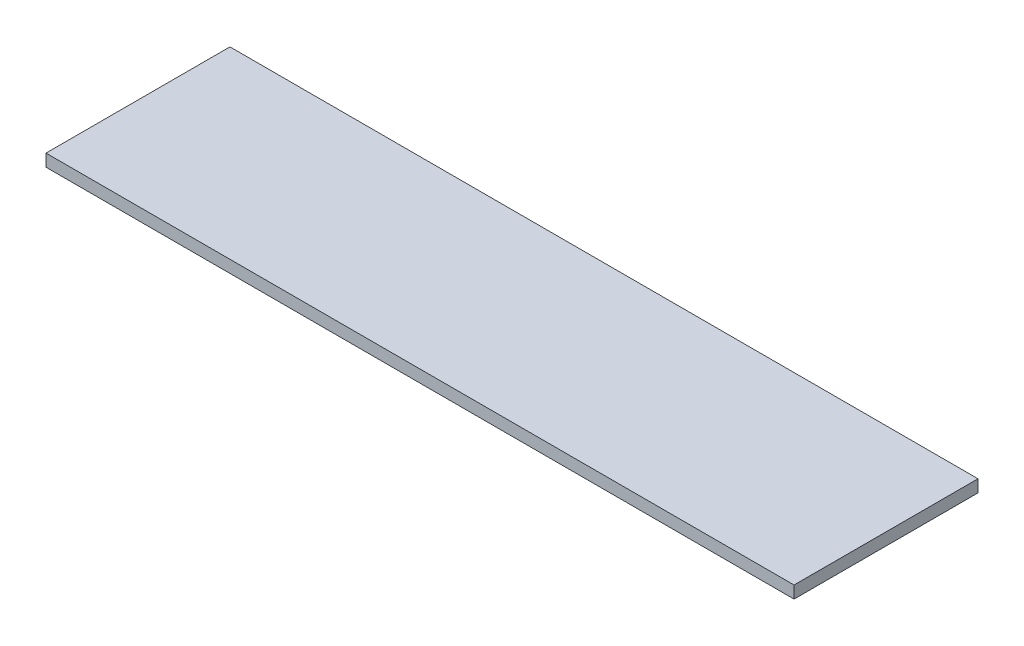
ISO-10303-21;
HEADER;
FILE_DESCRIPTION(('STEP AP214'),'2;1');
FILE_NAME('part.step','',(''),(''),'','','');
FILE_SCHEMA(('AUTOMOTIVE_DESIGN { 1 0 10303 214 1 1 1 1 }'));
ENDSEC;
DATA;
#1=APPLICATION_CONTEXT('core data for automotive mechanical design processes');
#2=APPLICATION_PROTOCOL_DEFINITION('international standard','automotive_design',2000,#1);
#3=PRODUCT_CONTEXT('',#1,'mechanical');
#4=PRODUCT('Part','Part','',(#3));
#5=PRODUCT_RELATED_PRODUCT_CATEGORY('part','',(#4));
#6=PRODUCT_DEFINITION_FORMATION('','',#4);
#7=PRODUCT_DEFINITION_CONTEXT('part definition',#1,'design');
#8=PRODUCT_DEFINITION('design','',#6,#7);
#9=PRODUCT_DEFINITION_SHAPE('','',#8);
#10=(LENGTH_UNIT() NAMED_UNIT(*) SI_UNIT(.MILLI.,.METRE.));
#11=(NAMED_UNIT(*) PLANE_ANGLE_UNIT() SI_UNIT($,.RADIAN.));
#12=(NAMED_UNIT(*) SI_UNIT($,.STERADIAN.) SOLID_ANGLE_UNIT());
#13=UNCERTAINTY_MEASURE_WITH_UNIT(LENGTH_MEASURE(1.E-05),#10,'distance_accuracy_value','');
#14=(GEOMETRIC_REPRESENTATION_CONTEXT(3) GLOBAL_UNCERTAINTY_ASSIGNED_CONTEXT((#13)) GLOBAL_UNIT_ASSIGNED_CONTEXT((#10,
#11,#12)) REPRESENTATION_CONTEXT('',''));
#15=CARTESIAN_POINT('',(0.,0.,0.));
#16=DIRECTION('',(0.,0.,1.));
#17=DIRECTION('',(1.,0.,0.));
#18=AXIS2_PLACEMENT_3D('',#15,#16,#17);
#19=CARTESIAN_POINT('',(0.,12.7,0.));
#20=DIRECTION('',(1.,0.,0.));
#21=DIRECTION('',(0.,0.,-1.));
#22=AXIS2_PLACEMENT_3D('',#19,#20,#21);
#23=PLANE('',#22);
#24=DIRECTION('',(0.,0.,1.));
#25=VECTOR('',#24,1.);
#26=CARTESIAN_POINT('',(0.,0.,0.));
#27=LINE('',#26,#25);
#28=CARTESIAN_POINT('',(0.,0.,-190.5));
#29=VERTEX_POINT('',#28);
#30=CARTESIAN_POINT('',(0.,0.,0.));
#31=VERTEX_POINT('',#30);
#32=EDGE_CURVE('E113',#29,#31,#27,.T.);
#33=ORIENTED_EDGE('',*,*,#32,.T.);
#34=DIRECTION('',(0.,-1.,0.));
#35=VECTOR('',#34,1.);
#36=CARTESIAN_POINT('',(0.,12.7,0.));
#37=LINE('',#36,#35);
#38=CARTESIAN_POINT('',(0.,12.7,0.));
#39=VERTEX_POINT('',#38);
#40=EDGE_CURVE('E11',#39,#31,#37,.T.);
#41=ORIENTED_EDGE('',*,*,#40,.F.);
#42=DIRECTION('',(0.,0.,1.));
#43=VECTOR('',#42,1.);
#44=CARTESIAN_POINT('',(0.,12.7,0.));
#45=LINE('',#44,#43);
#46=CARTESIAN_POINT('',(0.,12.7,-190.5));
#47=VERTEX_POINT('',#46);
#48=EDGE_CURVE('E97',#47,#39,#45,.T.);
#49=ORIENTED_EDGE('',*,*,#48,.F.);
#50=DIRECTION('',(0.,-1.,0.));
#51=VECTOR('',#50,1.);
#52=CARTESIAN_POINT('',(0.,12.7,-190.5));
#53=LINE('',#52,#51);
#54=EDGE_CURVE('E109',#47,#29,#53,.T.);
#55=ORIENTED_EDGE('',*,*,#54,.T.);
#56=EDGE_LOOP('',(#33,#41,#49,#55));
#57=FACE_BOUND('',#56,.T.);
#58=ADVANCED_FACE('F45',(#57),#23,.F.);
#59=CARTESIAN_POINT('',(0.,12.7,0.));
#60=DIRECTION('',(0.,0.,-1.));
#61=DIRECTION('',(-1.,0.,0.));
#62=AXIS2_PLACEMENT_3D('',#59,#60,#61);
#63=PLANE('',#62);
#64=DIRECTION('',(1.,0.,0.));
#65=VECTOR('',#64,1.);
#66=CARTESIAN_POINT('',(0.,0.,0.));
#67=LINE('',#66,#65);
#68=CARTESIAN_POINT('',(774.7,0.,0.));
#69=VERTEX_POINT('',#68);
#70=EDGE_CURVE('E102',#31,#69,#67,.T.);
#71=ORIENTED_EDGE('',*,*,#70,.T.);
#72=DIRECTION('',(0.,-1.,0.));
#73=VECTOR('',#72,1.);
#74=CARTESIAN_POINT('',(774.7,12.7,0.));
#75=LINE('',#74,#73);
#76=CARTESIAN_POINT('',(774.7,12.7,0.));
#77=VERTEX_POINT('',#76);
#78=EDGE_CURVE('E54',#77,#69,#75,.T.);
#79=ORIENTED_EDGE('',*,*,#78,.F.);
#80=DIRECTION('',(1.,0.,0.));
#81=VECTOR('',#80,1.);
#82=CARTESIAN_POINT('',(0.,12.7,0.));
#83=LINE('',#82,#81);
#84=EDGE_CURVE('E92',#39,#77,#83,.T.);
#85=ORIENTED_EDGE('',*,*,#84,.F.);
#86=ORIENTED_EDGE('',*,*,#40,.T.);
#87=EDGE_LOOP('',(#71,#79,#85,#86));
#88=FACE_BOUND('',#87,.T.);
#89=ADVANCED_FACE('F101',(#88),#63,.F.);
#90=CARTESIAN_POINT('',(774.7,12.7,0.));
#91=DIRECTION('',(-1.,0.,0.));
#92=DIRECTION('',(0.,0.,1.));
#93=AXIS2_PLACEMENT_3D('',#90,#91,#92);
#94=PLANE('',#93);
#95=DIRECTION('',(0.,0.,-1.));
#96=VECTOR('',#95,1.);
#97=CARTESIAN_POINT('',(774.7,0.,0.));
#98=LINE('',#97,#96);
#99=CARTESIAN_POINT('',(774.7,0.,-190.5));
#100=VERTEX_POINT('',#99);
#101=EDGE_CURVE('E79',#69,#100,#98,.T.);
#102=ORIENTED_EDGE('',*,*,#101,.T.);
#103=DIRECTION('',(0.,-1.,0.));
#104=VECTOR('',#103,1.);
#105=CARTESIAN_POINT('',(774.7,12.7,-190.5));
#106=LINE('',#105,#104);
#107=CARTESIAN_POINT('',(774.7,12.7,-190.5));
#108=VERTEX_POINT('',#107);
#109=EDGE_CURVE('E104',#108,#100,#106,.T.);
#110=ORIENTED_EDGE('',*,*,#109,.F.);
#111=DIRECTION('',(0.,0.,-1.));
#112=VECTOR('',#111,1.);
#113=CARTESIAN_POINT('',(774.7,12.7,0.));
#114=LINE('',#113,#112);
#115=EDGE_CURVE('E95',#77,#108,#114,.T.);
#116=ORIENTED_EDGE('',*,*,#115,.F.);
#117=ORIENTED_EDGE('',*,*,#78,.T.);
#118=EDGE_LOOP('',(#102,#110,#116,#117));
#119=FACE_BOUND('',#118,.T.);
#120=ADVANCED_FACE('F105',(#119),#94,.F.);
#121=CARTESIAN_POINT('',(0.,12.7,-190.5));
#122=DIRECTION('',(0.,0.,1.));
#123=DIRECTION('',(1.,0.,0.));
#124=AXIS2_PLACEMENT_3D('',#121,#122,#123);
#125=PLANE('',#124);
#126=DIRECTION('',(-1.,0.,0.));
#127=VECTOR('',#126,1.);
#128=CARTESIAN_POINT('',(0.,0.,-190.5));
#129=LINE('',#128,#127);
#130=EDGE_CURVE('E85',#100,#29,#129,.T.);
#131=ORIENTED_EDGE('',*,*,#130,.T.);
#132=ORIENTED_EDGE('',*,*,#54,.F.);
#133=DIRECTION('',(-1.,0.,0.));
#134=VECTOR('',#133,1.);
#135=CARTESIAN_POINT('',(0.,12.7,-190.5));
#136=LINE('',#135,#134);
#137=EDGE_CURVE('E62',#108,#47,#136,.T.);
#138=ORIENTED_EDGE('',*,*,#137,.F.);
#139=ORIENTED_EDGE('',*,*,#109,.T.);
#140=EDGE_LOOP('',(#131,#132,#138,#139));
#141=FACE_BOUND('',#140,.T.);
#142=ADVANCED_FACE('F126',(#141),#125,.F.);
#143=CARTESIAN_POINT('',(0.,12.7,0.));
#144=DIRECTION('',(0.,-1.,0.));
#145=DIRECTION('',(0.,0.,-1.));
#146=AXIS2_PLACEMENT_3D('',#143,#144,#145);
#147=PLANE('',#146);
#148=ORIENTED_EDGE('',*,*,#48,.T.);
#149=ORIENTED_EDGE('',*,*,#84,.T.);
#150=ORIENTED_EDGE('',*,*,#115,.T.);
#151=ORIENTED_EDGE('',*,*,#137,.T.);
#152=EDGE_LOOP('',(#148,#149,#150,#151));
#153=FACE_BOUND('',#152,.T.);
#154=ADVANCED_FACE('F93',(#153),#147,.F.);
#155=CARTESIAN_POINT('',(0.,0.,0.));
#156=DIRECTION('',(0.,-1.,0.));
#157=DIRECTION('',(0.,0.,-1.));
#158=AXIS2_PLACEMENT_3D('',#155,#156,#157);
#159=PLANE('',#158);
#160=ORIENTED_EDGE('',*,*,#32,.F.);
#161=ORIENTED_EDGE('',*,*,#130,.F.);
#162=ORIENTED_EDGE('',*,*,#101,.F.);
#163=ORIENTED_EDGE('',*,*,#70,.F.);
#164=EDGE_LOOP('',(#160,#161,#162,#163));
#165=FACE_BOUND('',#164,.T.);
#166=ADVANCED_FACE('F129',(#165),#159,.T.);
#167=CLOSED_SHELL('',(#58,#89,#120,#142,#154,#166));
#168=MANIFOLD_SOLID_BREP('B2',#167);
#169=ADVANCED_BREP_SHAPE_REPRESENTATION('',(#18,#168),#14);
#170=SHAPE_DEFINITION_REPRESENTATION(#9,#169);
ENDSEC;
END-ISO-10303-21;
